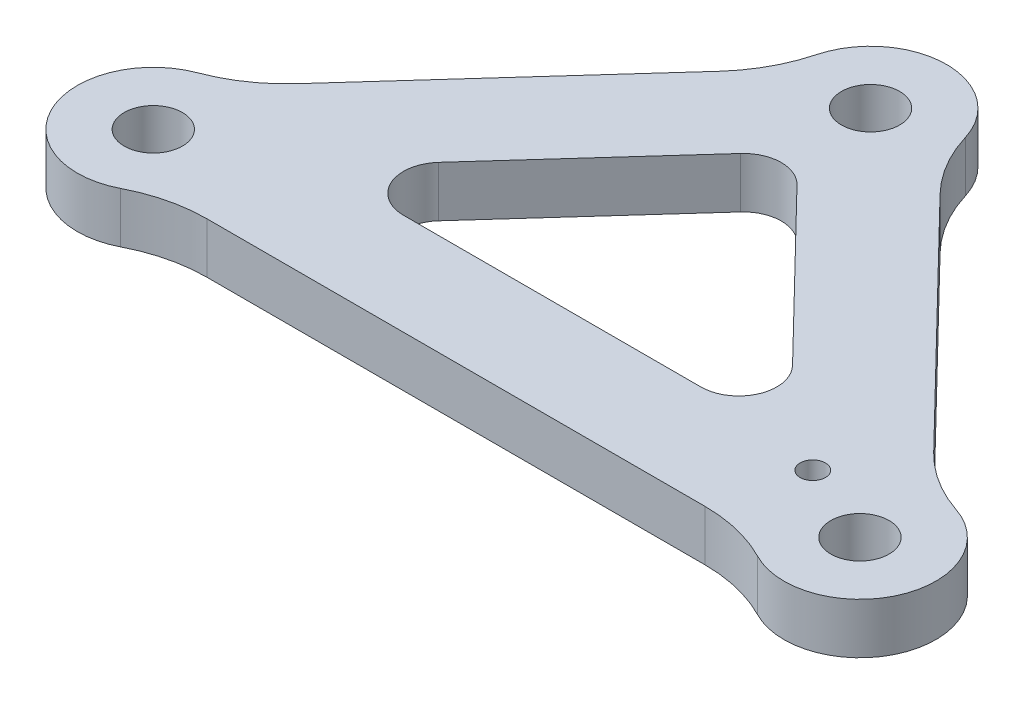
ISO-10303-21;
HEADER;
FILE_DESCRIPTION(('STEP AP214'),'2;1');
FILE_NAME('part.step','',(''),(''),'','','');
FILE_SCHEMA(('AUTOMOTIVE_DESIGN { 1 0 10303 214 1 1 1 1 }'));
ENDSEC;
DATA;
#1=APPLICATION_CONTEXT('core data for automotive mechanical design processes');
#2=APPLICATION_PROTOCOL_DEFINITION('international standard','automotive_design',2000,#1);
#3=PRODUCT_CONTEXT('',#1,'mechanical');
#4=PRODUCT('Part','Part','',(#3));
#5=PRODUCT_RELATED_PRODUCT_CATEGORY('part','',(#4));
#6=PRODUCT_DEFINITION_FORMATION('','',#4);
#7=PRODUCT_DEFINITION_CONTEXT('part definition',#1,'design');
#8=PRODUCT_DEFINITION('design','',#6,#7);
#9=PRODUCT_DEFINITION_SHAPE('','',#8);
#10=(LENGTH_UNIT() NAMED_UNIT(*) SI_UNIT(.MILLI.,.METRE.));
#11=(NAMED_UNIT(*) PLANE_ANGLE_UNIT() SI_UNIT($,.RADIAN.));
#12=(NAMED_UNIT(*) SI_UNIT($,.STERADIAN.) SOLID_ANGLE_UNIT());
#13=UNCERTAINTY_MEASURE_WITH_UNIT(LENGTH_MEASURE(1.E-05),#10,'distance_accuracy_value','');
#14=(GEOMETRIC_REPRESENTATION_CONTEXT(3) GLOBAL_UNCERTAINTY_ASSIGNED_CONTEXT((#13)) GLOBAL_UNIT_ASSIGNED_CONTEXT((#10,
#11,#12)) REPRESENTATION_CONTEXT('',''));
#15=CARTESIAN_POINT('',(0.,0.,0.));
#16=DIRECTION('',(0.,0.,1.));
#17=DIRECTION('',(1.,0.,0.));
#18=AXIS2_PLACEMENT_3D('',#15,#16,#17);
#19=CARTESIAN_POINT('',(-1.48430145110191,2.,-1.34046603920307));
#20=DIRECTION('',(0.742150725550956,0.,0.670233019601534));
#21=DIRECTION('',(0.670233019601534,0.,-0.742150725550956));
#22=AXIS2_PLACEMENT_3D('',#19,#20,#21);
#23=PLANE('',#22);
#24=DIRECTION('',(-0.670233019601534,0.,0.742150725550956));
#25=VECTOR('',#24,1.);
#26=CARTESIAN_POINT('',(-1.48430145110191,2.,-1.34046603920307));
#27=LINE('',#26,#25);
#28=CARTESIAN_POINT('',(9.19042905831505,2.,-13.1606222549244));
#29=VERTEX_POINT('',#28);
#30=CARTESIAN_POINT('',(1.27914008249189,2.,-4.40043187077845));
#31=VERTEX_POINT('',#30);
#32=EDGE_CURVE('E300',#29,#31,#27,.T.);
#33=ORIENTED_EDGE('',*,*,#32,.F.);
#34=DIRECTION('',(0.,1.,0.));
#35=VECTOR('',#34,1.);
#36=CARTESIAN_POINT('',(9.19042905831505,0.,-13.1606222549244));
#37=LINE('',#36,#35);
#38=CARTESIAN_POINT('',(9.19042905831505,0.,-13.1606222549244));
#39=VERTEX_POINT('',#38);
#40=EDGE_CURVE('E209',#29,#39,#37,.F.);
#41=ORIENTED_EDGE('',*,*,#40,.T.);
#42=DIRECTION('',(-0.670233019601534,0.,0.742150725550956));
#43=VECTOR('',#42,1.);
#44=CARTESIAN_POINT('',(-1.48430145110191,0.,-1.34046603920307));
#45=LINE('',#44,#43);
#46=CARTESIAN_POINT('',(1.27914008249189,0.,-4.40043187077845));
#47=VERTEX_POINT('',#46);
#48=EDGE_CURVE('E331',#39,#47,#45,.T.);
#49=ORIENTED_EDGE('',*,*,#48,.T.);
#50=DIRECTION('',(0.,1.,0.));
#51=VECTOR('',#50,1.);
#52=CARTESIAN_POINT('',(1.27914008249189,2.,-4.40043187077845));
#53=LINE('',#52,#51);
#54=EDGE_CURVE('E207',#47,#31,#53,.T.);
#55=ORIENTED_EDGE('',*,*,#54,.T.);
#56=EDGE_LOOP('',(#33,#41,#49,#55));
#57=FACE_BOUND('',#56,.T.);
#58=ADVANCED_FACE('F41',(#57),#23,.F.);
#59=CARTESIAN_POINT('',(0.,2.,0.));
#60=DIRECTION('',(0.,-1.,0.));
#61=DIRECTION('',(0.,0.,-1.));
#62=AXIS2_PLACEMENT_3D('',#59,#60,#61);
#63=CYLINDRICAL_SURFACE('',#62,3.);
#64=CARTESIAN_POINT('',(0.,2.,0.));
#65=DIRECTION('',(0.,1.,0.));
#66=DIRECTION('',(0.,0.,1.));
#67=AXIS2_PLACEMENT_3D('',#64,#65,#66);
#68=CIRCLE('',#67,3.);
#69=CARTESIAN_POINT('',(-1.05792142360461,2.,-2.80727666279588));
#70=VERTEX_POINT('',#69);
#71=CARTESIAN_POINT('',(1.37436854187255,2.,2.66666666666667));
#72=VERTEX_POINT('',#71);
#73=EDGE_CURVE('E303',#70,#72,#68,.T.);
#74=ORIENTED_EDGE('',*,*,#73,.F.);
#75=DIRECTION('',(0.,-1.,0.));
#76=VECTOR('',#75,1.);
#77=CARTESIAN_POINT('',(-1.05792142360461,2.,-2.80727666279588));
#78=LINE('',#77,#76);
#79=CARTESIAN_POINT('',(-1.05792142360461,0.,-2.80727666279588));
#80=VERTEX_POINT('',#79);
#81=EDGE_CURVE('E214',#70,#80,#78,.T.);
#82=ORIENTED_EDGE('',*,*,#81,.T.);
#83=CARTESIAN_POINT('',(0.,0.,0.));
#84=DIRECTION('',(0.,1.,0.));
#85=DIRECTION('',(0.,0.,1.));
#86=AXIS2_PLACEMENT_3D('',#83,#84,#85);
#87=CIRCLE('',#86,3.);
#88=CARTESIAN_POINT('',(1.37436854187255,0.,2.66666666666667));
#89=VERTEX_POINT('',#88);
#90=EDGE_CURVE('E334',#80,#89,#87,.T.);
#91=ORIENTED_EDGE('',*,*,#90,.T.);
#92=DIRECTION('',(0.,-1.,0.));
#93=VECTOR('',#92,1.);
#94=CARTESIAN_POINT('',(1.37436854187255,2.,2.66666666666667));
#95=LINE('',#94,#93);
#96=EDGE_CURVE('E212',#89,#72,#95,.F.);
#97=ORIENTED_EDGE('',*,*,#96,.T.);
#98=EDGE_LOOP('',(#74,#82,#91,#97));
#99=FACE_BOUND('',#98,.T.);
#100=ADVANCED_FACE('F369',(#99),#63,.T.);
#101=CARTESIAN_POINT('',(0.,2.,2.));
#102=DIRECTION('',(0.,0.,1.));
#103=DIRECTION('',(1.,0.,0.));
#104=AXIS2_PLACEMENT_3D('',#101,#102,#103);
#105=PLANE('',#104);
#106=DIRECTION('',(-1.,0.,0.));
#107=VECTOR('',#106,1.);
#108=CARTESIAN_POINT('',(0.,2.,2.));
#109=LINE('',#108,#107);
#110=CARTESIAN_POINT('',(23.7768943743823,2.,2.));
#111=VERTEX_POINT('',#110);
#112=CARTESIAN_POINT('',(4.12310562561766,2.,2.));
#113=VERTEX_POINT('',#112);
#114=EDGE_CURVE('E306',#111,#113,#109,.T.);
#115=ORIENTED_EDGE('',*,*,#114,.T.);
#116=DIRECTION('',(0.,-1.,0.));
#117=VECTOR('',#116,1.);
#118=CARTESIAN_POINT('',(4.12310562561766,2.,2.));
#119=LINE('',#118,#117);
#120=CARTESIAN_POINT('',(4.12310562561766,0.,2.));
#121=VERTEX_POINT('',#120);
#122=EDGE_CURVE('E219',#113,#121,#119,.T.);
#123=ORIENTED_EDGE('',*,*,#122,.T.);
#124=DIRECTION('',(-1.,0.,0.));
#125=VECTOR('',#124,1.);
#126=CARTESIAN_POINT('',(0.,0.,2.));
#127=LINE('',#126,#125);
#128=CARTESIAN_POINT('',(23.7768943743823,0.,2.));
#129=VERTEX_POINT('',#128);
#130=EDGE_CURVE('E337',#129,#121,#127,.T.);
#131=ORIENTED_EDGE('',*,*,#130,.F.);
#132=DIRECTION('',(0.,-1.,0.));
#133=VECTOR('',#132,1.);
#134=CARTESIAN_POINT('',(23.7768943743823,2.,2.));
#135=LINE('',#134,#133);
#136=EDGE_CURVE('E217',#129,#111,#135,.F.);
#137=ORIENTED_EDGE('',*,*,#136,.T.);
#138=EDGE_LOOP('',(#115,#123,#131,#137));
#139=FACE_BOUND('',#138,.T.);
#140=ADVANCED_FACE('F365',(#139),#105,.T.);
#141=CARTESIAN_POINT('',(27.9,2.,0.));
#142=DIRECTION('',(0.,-1.,0.));
#143=DIRECTION('',(0.,0.,-1.));
#144=AXIS2_PLACEMENT_3D('',#141,#142,#143);
#145=CYLINDRICAL_SURFACE('',#144,3.);
#146=CARTESIAN_POINT('',(27.9,2.,0.));
#147=DIRECTION('',(0.,1.,0.));
#148=DIRECTION('',(0.,0.,1.));
#149=AXIS2_PLACEMENT_3D('',#146,#147,#148);
#150=CIRCLE('',#149,3.);
#151=CARTESIAN_POINT('',(26.5256314581274,2.,2.66666666666667));
#152=VERTEX_POINT('',#151);
#153=CARTESIAN_POINT('',(28.8544310389108,2.,-2.8441275273735));
#154=VERTEX_POINT('',#153);
#155=EDGE_CURVE('E309',#152,#154,#150,.T.);
#156=ORIENTED_EDGE('',*,*,#155,.F.);
#157=DIRECTION('',(0.,-1.,0.));
#158=VECTOR('',#157,1.);
#159=CARTESIAN_POINT('',(26.5256314581274,2.,2.66666666666667));
#160=LINE('',#159,#158);
#161=CARTESIAN_POINT('',(26.5256314581274,0.,2.66666666666667));
#162=VERTEX_POINT('',#161);
#163=EDGE_CURVE('E177',#152,#162,#160,.T.);
#164=ORIENTED_EDGE('',*,*,#163,.T.);
#165=CARTESIAN_POINT('',(27.9,0.,0.));
#166=DIRECTION('',(0.,1.,0.));
#167=DIRECTION('',(0.,0.,1.));
#168=AXIS2_PLACEMENT_3D('',#165,#166,#167);
#169=CIRCLE('',#168,3.);
#170=CARTESIAN_POINT('',(28.8544310389108,0.,-2.8441275273735));
#171=VERTEX_POINT('',#170);
#172=EDGE_CURVE('E199',#162,#171,#169,.T.);
#173=ORIENTED_EDGE('',*,*,#172,.T.);
#174=DIRECTION('',(0.,-1.,0.));
#175=VECTOR('',#174,1.);
#176=CARTESIAN_POINT('',(28.8544310389108,2.,-2.8441275273735));
#177=LINE('',#176,#175);
#178=EDGE_CURVE('E222',#171,#154,#177,.F.);
#179=ORIENTED_EDGE('',*,*,#178,.T.);
#180=EDGE_LOOP('',(#156,#164,#173,#179));
#181=FACE_BOUND('',#180,.T.);
#182=ADVANCED_FACE('F344',(#181),#145,.T.);
#183=CARTESIAN_POINT('',(15.7818857000714,2.,-15.338242193569));
#184=DIRECTION('',(0.71711431553237,0.,-0.696955564192253));
#185=DIRECTION('',(-0.696955564192253,0.,-0.71711431553237));
#186=AXIS2_PLACEMENT_3D('',#183,#184,#185);
#187=PLANE('',#186);
#188=DIRECTION('',(0.696955564192253,0.,0.71711431553237));
#189=VECTOR('',#188,1.);
#190=CARTESIAN_POINT('',(15.7818857000714,0.,-15.338242193569));
#191=LINE('',#190,#189);
#192=CARTESIAN_POINT('',(17.7460220816021,0.,-13.3172951070987));
#193=VERTEX_POINT('',#192);
#194=CARTESIAN_POINT('',(26.4606072235381,0.,-4.35064919696697));
#195=VERTEX_POINT('',#194);
#196=EDGE_CURVE('E194',#193,#195,#191,.T.);
#197=ORIENTED_EDGE('',*,*,#196,.F.);
#198=DIRECTION('',(0.,-1.,0.));
#199=VECTOR('',#198,1.);
#200=CARTESIAN_POINT('',(17.7460220816021,2.,-13.3172951070987));
#201=LINE('',#200,#199);
#202=CARTESIAN_POINT('',(17.7460220816021,2.,-13.3172951070987));
#203=VERTEX_POINT('',#202);
#204=EDGE_CURVE('E171',#193,#203,#201,.F.);
#205=ORIENTED_EDGE('',*,*,#204,.T.);
#206=DIRECTION('',(0.696955564192253,0.,0.71711431553237));
#207=VECTOR('',#206,1.);
#208=CARTESIAN_POINT('',(15.7818857000714,2.,-15.338242193569));
#209=LINE('',#208,#207);
#210=CARTESIAN_POINT('',(26.4606072235381,2.,-4.35064919696697));
#211=VERTEX_POINT('',#210);
#212=EDGE_CURVE('E312',#203,#211,#209,.T.);
#213=ORIENTED_EDGE('',*,*,#212,.T.);
#214=DIRECTION('',(0.,-1.,0.));
#215=VECTOR('',#214,1.);
#216=CARTESIAN_POINT('',(26.4606072235381,2.,-4.35064919696697));
#217=LINE('',#216,#215);
#218=EDGE_CURVE('E187',#211,#195,#217,.T.);
#219=ORIENTED_EDGE('',*,*,#218,.T.);
#220=EDGE_LOOP('',(#197,#205,#213,#219));
#221=FACE_BOUND('',#220,.T.);
#222=ADVANCED_FACE('F354',(#221),#187,.T.);
#223=CARTESIAN_POINT('',(1.48430145110192,2.,1.34046603920307));
#224=DIRECTION('',(0.742150725550956,0.,0.670233019601534));
#225=DIRECTION('',(0.670233019601534,0.,-0.742150725550956));
#226=AXIS2_PLACEMENT_3D('',#223,#224,#225);
#227=PLANE('',#226);
#228=DIRECTION('',(-0.670233019601534,0.,0.742150725550956));
#229=VECTOR('',#228,1.);
#230=CARTESIAN_POINT('',(1.48430145110192,0.,1.34046603920307));
#231=LINE('',#230,#229);
#232=CARTESIAN_POINT('',(12.4186735848156,0.,-10.7671920068065));
#233=VERTEX_POINT('',#232);
#234=CARTESIAN_POINT('',(6.76363149241038,0.,-4.5053495294023));
#235=VERTEX_POINT('',#234);
#236=EDGE_CURVE('E281',#233,#235,#231,.T.);
#237=ORIENTED_EDGE('',*,*,#236,.F.);
#238=DIRECTION('',(0.,-1.,0.));
#239=VECTOR('',#238,1.);
#240=CARTESIAN_POINT('',(12.4186735848156,2.,-10.7671920068065));
#241=LINE('',#240,#239);
#242=CARTESIAN_POINT('',(12.4186735848156,2.,-10.7671920068065));
#243=VERTEX_POINT('',#242);
#244=EDGE_CURVE('E254',#233,#243,#241,.F.);
#245=ORIENTED_EDGE('',*,*,#244,.T.);
#246=DIRECTION('',(-0.670233019601534,0.,0.742150725550956));
#247=VECTOR('',#246,1.);
#248=CARTESIAN_POINT('',(1.48430145110192,2.,1.34046603920307));
#249=LINE('',#248,#247);
#250=CARTESIAN_POINT('',(6.76363149241038,2.,-4.5053495294023));
#251=VERTEX_POINT('',#250);
#252=EDGE_CURVE('E197',#243,#251,#249,.T.);
#253=ORIENTED_EDGE('',*,*,#252,.T.);
#254=DIRECTION('',(0.,-1.,0.));
#255=VECTOR('',#254,1.);
#256=CARTESIAN_POINT('',(6.76363149241038,2.,-4.5053495294023));
#257=LINE('',#256,#255);
#258=EDGE_CURVE('E251',#251,#235,#257,.T.);
#259=ORIENTED_EDGE('',*,*,#258,.T.);
#260=EDGE_LOOP('',(#237,#245,#253,#259));
#261=FACE_BOUND('',#260,.T.);
#262=ADVANCED_FACE('F356',(#261),#227,.T.);
#263=CARTESIAN_POINT('',(12.913428437942,2.,-12.5504199368));
#264=DIRECTION('',(0.717114315532369,0.,-0.696955564192253));
#265=DIRECTION('',(-0.696955564192253,0.,-0.717114315532369));
#266=AXIS2_PLACEMENT_3D('',#263,#264,#265);
#267=PLANE('',#266);
#268=DIRECTION('',(0.696955564192253,0.,0.717114315532369));
#269=VECTOR('',#268,1.);
#270=CARTESIAN_POINT('',(12.913428437942,2.,-12.5504199368));
#271=LINE('',#270,#269);
#272=CARTESIAN_POINT('',(14.6075711464406,2.,-10.8072758236926));
#273=VERTEX_POINT('',#272);
#274=CARTESIAN_POINT('',(20.6933873994356,2.,-4.54543334628838));
#275=VERTEX_POINT('',#274);
#276=EDGE_CURVE('E287',#273,#275,#271,.T.);
#277=ORIENTED_EDGE('',*,*,#276,.F.);
#278=DIRECTION('',(0.,-1.,0.));
#279=VECTOR('',#278,1.);
#280=CARTESIAN_POINT('',(14.6075711464406,2.,-10.8072758236926));
#281=LINE('',#280,#279);
#282=CARTESIAN_POINT('',(14.6075711464406,0.,-10.8072758236926));
#283=VERTEX_POINT('',#282);
#284=EDGE_CURVE('E248',#273,#283,#281,.T.);
#285=ORIENTED_EDGE('',*,*,#284,.T.);
#286=DIRECTION('',(0.696955564192253,0.,0.717114315532369));
#287=VECTOR('',#286,1.);
#288=CARTESIAN_POINT('',(12.913428437942,0.,-12.5504199368));
#289=LINE('',#288,#287);
#290=CARTESIAN_POINT('',(20.6933873994356,0.,-4.54543334628838));
#291=VERTEX_POINT('',#290);
#292=EDGE_CURVE('E272',#283,#291,#289,.T.);
#293=ORIENTED_EDGE('',*,*,#292,.T.);
#294=DIRECTION('',(0.,-1.,0.));
#295=VECTOR('',#294,1.);
#296=CARTESIAN_POINT('',(20.6933873994356,2.,-4.54543334628838));
#297=LINE('',#296,#295);
#298=EDGE_CURVE('E246',#291,#275,#297,.F.);
#299=ORIENTED_EDGE('',*,*,#298,.T.);
#300=EDGE_LOOP('',(#277,#285,#293,#299));
#301=FACE_BOUND('',#300,.T.);
#302=ADVANCED_FACE('F279',(#301),#267,.F.);
#303=CARTESIAN_POINT('',(13.4381720430108,2.,-14.8801220472967));
#304=DIRECTION('',(0.,-1.,0.));
#305=DIRECTION('',(0.,0.,-1.));
#306=AXIS2_PLACEMENT_3D('',#303,#304,#305);
#307=CYLINDRICAL_SURFACE('',#306,1.15);
#308=CARTESIAN_POINT('',(13.4381720430108,2.,-14.8801220472967));
#309=DIRECTION('',(0.,1.,0.));
#310=DIRECTION('',(0.,0.,1.));
#311=AXIS2_PLACEMENT_3D('',#308,#309,#310);
#312=CIRCLE('',#311,1.15);
#313=CARTESIAN_POINT('',(13.4381720430108,2.,-13.7301220472967));
#314=VERTEX_POINT('',#313);
#315=EDGE_CURVE('E297',#314,#314,#312,.T.);
#316=ORIENTED_EDGE('',*,*,#315,.T.);
#317=EDGE_LOOP('',(#316));
#318=FACE_BOUND('',#317,.T.);
#319=CARTESIAN_POINT('',(13.4381720430108,0.,-14.8801220472967));
#320=DIRECTION('',(0.,1.,0.));
#321=DIRECTION('',(0.,0.,1.));
#322=AXIS2_PLACEMENT_3D('',#319,#320,#321);
#323=CIRCLE('',#322,1.15);
#324=CARTESIAN_POINT('',(13.4381720430108,0.,-13.7301220472967));
#325=VERTEX_POINT('',#324);
#326=EDGE_CURVE('E328',#325,#325,#323,.T.);
#327=ORIENTED_EDGE('',*,*,#326,.F.);
#328=EDGE_LOOP('',(#327));
#329=FACE_BOUND('',#328,.T.);
#330=ADVANCED_FACE('F381',(#318,#329),#307,.F.);
#331=CARTESIAN_POINT('',(27.9,2.,0.));
#332=DIRECTION('',(0.,-1.,0.));
#333=DIRECTION('',(0.,0.,-1.));
#334=AXIS2_PLACEMENT_3D('',#331,#332,#333);
#335=CYLINDRICAL_SURFACE('',#334,1.15);
#336=CARTESIAN_POINT('',(27.9,2.,0.));
#337=DIRECTION('',(0.,1.,0.));
#338=DIRECTION('',(0.,0.,1.));
#339=AXIS2_PLACEMENT_3D('',#336,#337,#338);
#340=CIRCLE('',#339,1.15);
#341=CARTESIAN_POINT('',(27.9,2.,1.15));
#342=VERTEX_POINT('',#341);
#343=EDGE_CURVE('E290',#342,#342,#340,.T.);
#344=ORIENTED_EDGE('',*,*,#343,.T.);
#345=EDGE_LOOP('',(#344));
#346=FACE_BOUND('',#345,.T.);
#347=CARTESIAN_POINT('',(27.9,0.,0.));
#348=DIRECTION('',(0.,1.,0.));
#349=DIRECTION('',(0.,0.,1.));
#350=AXIS2_PLACEMENT_3D('',#347,#348,#349);
#351=CIRCLE('',#350,1.15);
#352=CARTESIAN_POINT('',(27.9,0.,1.15));
#353=VERTEX_POINT('',#352);
#354=EDGE_CURVE('E325',#353,#353,#351,.T.);
#355=ORIENTED_EDGE('',*,*,#354,.F.);
#356=EDGE_LOOP('',(#355));
#357=FACE_BOUND('',#356,.T.);
#358=ADVANCED_FACE('F384',(#346,#357),#335,.F.);
#359=CARTESIAN_POINT('',(0.,2.,0.));
#360=DIRECTION('',(0.,-1.,0.));
#361=DIRECTION('',(0.,0.,-1.));
#362=AXIS2_PLACEMENT_3D('',#359,#360,#361);
#363=CYLINDRICAL_SURFACE('',#362,1.15);
#364=CARTESIAN_POINT('',(0.,2.,0.));
#365=DIRECTION('',(0.,1.,0.));
#366=DIRECTION('',(0.,0.,1.));
#367=AXIS2_PLACEMENT_3D('',#364,#365,#366);
#368=CIRCLE('',#367,1.15);
#369=CARTESIAN_POINT('',(0.,2.,1.15));
#370=VERTEX_POINT('',#369);
#371=EDGE_CURVE('E286',#370,#370,#368,.T.);
#372=ORIENTED_EDGE('',*,*,#371,.T.);
#373=EDGE_LOOP('',(#372));
#374=FACE_BOUND('',#373,.T.);
#375=CARTESIAN_POINT('',(0.,0.,0.));
#376=DIRECTION('',(0.,1.,0.));
#377=DIRECTION('',(0.,0.,1.));
#378=AXIS2_PLACEMENT_3D('',#375,#376,#377);
#379=CIRCLE('',#378,1.15);
#380=CARTESIAN_POINT('',(0.,0.,1.15));
#381=VERTEX_POINT('',#380);
#382=EDGE_CURVE('E322',#381,#381,#379,.T.);
#383=ORIENTED_EDGE('',*,*,#382,.F.);
#384=EDGE_LOOP('',(#383));
#385=FACE_BOUND('',#384,.T.);
#386=ADVANCED_FACE('F388',(#374,#385),#363,.F.);
#387=CARTESIAN_POINT('',(0.,2.,-2.));
#388=DIRECTION('',(0.,0.,1.));
#389=DIRECTION('',(1.,0.,0.));
#390=AXIS2_PLACEMENT_3D('',#387,#388,#389);
#391=PLANE('',#390);
#392=DIRECTION('',(-1.,0.,0.));
#393=VECTOR('',#392,1.);
#394=CARTESIAN_POINT('',(0.,0.,-2.));
#395=LINE('',#394,#393);
#396=CARTESIAN_POINT('',(19.617715926137,0.,-2.));
#397=VERTEX_POINT('',#396);
#398=CARTESIAN_POINT('',(7.87685758073681,0.,-2.));
#399=VERTEX_POINT('',#398);
#400=EDGE_CURVE('E273',#397,#399,#395,.T.);
#401=ORIENTED_EDGE('',*,*,#400,.T.);
#402=DIRECTION('',(0.,-1.,0.));
#403=VECTOR('',#402,1.);
#404=CARTESIAN_POINT('',(7.87685758073681,2.,-2.));
#405=LINE('',#404,#403);
#406=CARTESIAN_POINT('',(7.87685758073681,2.,-2.));
#407=VERTEX_POINT('',#406);
#408=EDGE_CURVE('E56',#399,#407,#405,.F.);
#409=ORIENTED_EDGE('',*,*,#408,.T.);
#410=DIRECTION('',(-1.,0.,0.));
#411=VECTOR('',#410,1.);
#412=CARTESIAN_POINT('',(0.,2.,-2.));
#413=LINE('',#412,#411);
#414=CARTESIAN_POINT('',(19.617715926137,2.,-2.));
#415=VERTEX_POINT('',#414);
#416=EDGE_CURVE('E284',#415,#407,#413,.T.);
#417=ORIENTED_EDGE('',*,*,#416,.F.);
#418=DIRECTION('',(0.,-1.,0.));
#419=VECTOR('',#418,1.);
#420=CARTESIAN_POINT('',(19.617715926137,0.,-2.));
#421=LINE('',#420,#419);
#422=EDGE_CURVE('E256',#415,#397,#421,.T.);
#423=ORIENTED_EDGE('',*,*,#422,.T.);
#424=EDGE_LOOP('',(#401,#409,#417,#423));
#425=FACE_BOUND('',#424,.T.);
#426=ADVANCED_FACE('F283',(#425),#391,.F.);
#427=CARTESIAN_POINT('',(24.6760501197014,2.,-1.36240492120458));
#428=DIRECTION('',(0.,-1.,0.));
#429=DIRECTION('',(0.,0.,-1.));
#430=AXIS2_PLACEMENT_3D('',#427,#428,#429);
#431=CYLINDRICAL_SURFACE('',#430,0.499999999999999);
#432=CARTESIAN_POINT('',(24.6760501197014,2.,-1.36240492120458));
#433=DIRECTION('',(0.,1.,0.));
#434=DIRECTION('',(0.,0.,1.));
#435=AXIS2_PLACEMENT_3D('',#432,#433,#434);
#436=CIRCLE('',#435,0.499999999999999);
#437=CARTESIAN_POINT('',(24.6760501197014,2.,-0.862404921204578));
#438=VERTEX_POINT('',#437);
#439=EDGE_CURVE('E193',#438,#438,#436,.T.);
#440=ORIENTED_EDGE('',*,*,#439,.T.);
#441=EDGE_LOOP('',(#440));
#442=FACE_BOUND('',#441,.T.);
#443=CARTESIAN_POINT('',(24.6760501197014,0.,-1.36240492120458));
#444=DIRECTION('',(0.,1.,0.));
#445=DIRECTION('',(0.,0.,1.));
#446=AXIS2_PLACEMENT_3D('',#443,#444,#445);
#447=CIRCLE('',#446,0.499999999999999);
#448=CARTESIAN_POINT('',(24.6760501197014,0.,-0.862404921204578));
#449=VERTEX_POINT('',#448);
#450=EDGE_CURVE('E316',#449,#449,#447,.T.);
#451=ORIENTED_EDGE('',*,*,#450,.F.);
#452=EDGE_LOOP('',(#451));
#453=FACE_BOUND('',#452,.T.);
#454=ADVANCED_FACE('F395',(#442,#453),#431,.F.);
#455=CARTESIAN_POINT('',(13.4381720430108,2.,-14.8801220472967));
#456=DIRECTION('',(0.,-1.,0.));
#457=DIRECTION('',(0.,0.,-1.));
#458=AXIS2_PLACEMENT_3D('',#455,#456,#457);
#459=CYLINDRICAL_SURFACE('',#458,3.);
#460=CARTESIAN_POINT('',(13.4381720430108,2.,-14.8801220472967));
#461=DIRECTION('',(0.,1.,0.));
#462=DIRECTION('',(0.,0.,1.));
#463=AXIS2_PLACEMENT_3D('',#460,#461,#462);
#464=CIRCLE('',#463,3.);
#465=CARTESIAN_POINT('',(16.3083506869393,2.,-15.7530908622819));
#466=VERTEX_POINT('',#465);
#467=CARTESIAN_POINT('',(10.5379562636769,2.,-15.6474214890423));
#468=VERTEX_POINT('',#467);
#469=EDGE_CURVE('E186',#466,#468,#464,.T.);
#470=ORIENTED_EDGE('',*,*,#469,.F.);
#471=DIRECTION('',(0.,-1.,0.));
#472=VECTOR('',#471,1.);
#473=CARTESIAN_POINT('',(16.3083506869393,2.,-15.7530908622819));
#474=LINE('',#473,#472);
#475=CARTESIAN_POINT('',(16.3083506869393,0.,-15.7530908622819));
#476=VERTEX_POINT('',#475);
#477=EDGE_CURVE('E170',#466,#476,#474,.T.);
#478=ORIENTED_EDGE('',*,*,#477,.T.);
#479=CARTESIAN_POINT('',(13.4381720430108,0.,-14.8801220472967));
#480=DIRECTION('',(0.,1.,0.));
#481=DIRECTION('',(0.,0.,1.));
#482=AXIS2_PLACEMENT_3D('',#479,#480,#481);
#483=CIRCLE('',#482,3.);
#484=CARTESIAN_POINT('',(10.5379562636769,0.,-15.6474214890423));
#485=VERTEX_POINT('',#484);
#486=EDGE_CURVE('E183',#476,#485,#483,.T.);
#487=ORIENTED_EDGE('',*,*,#486,.T.);
#488=DIRECTION('',(0.,-1.,0.));
#489=VECTOR('',#488,1.);
#490=CARTESIAN_POINT('',(10.5379562636769,2.,-15.6474214890423));
#491=LINE('',#490,#489);
#492=EDGE_CURVE('E188',#485,#468,#491,.F.);
#493=ORIENTED_EDGE('',*,*,#492,.T.);
#494=EDGE_LOOP('',(#470,#478,#487,#493));
#495=FACE_BOUND('',#494,.T.);
#496=ADVANCED_FACE('F182',(#495),#459,.T.);
#497=CARTESIAN_POINT('',(0.,2.,0.));
#498=DIRECTION('',(0.,1.,0.));
#499=DIRECTION('',(0.,0.,1.));
#500=AXIS2_PLACEMENT_3D('',#497,#498,#499);
#501=PLANE('',#500);
#502=ORIENTED_EDGE('',*,*,#439,.F.);
#503=EDGE_LOOP('',(#502));
#504=FACE_BOUND('',#503,.T.);
#505=ORIENTED_EDGE('',*,*,#252,.F.);
#506=CARTESIAN_POINT('',(13.5318996731421,2.,-9.76184247740419));
#507=DIRECTION('',(0.,1.,0.));
#508=DIRECTION('',(0.,0.,1.));
#509=AXIS2_PLACEMENT_3D('',#506,#507,#508);
#510=CIRCLE('',#509,1.5);
#511=EDGE_CURVE('E262',#243,#273,#510,.F.);
#512=ORIENTED_EDGE('',*,*,#511,.T.);
#513=ORIENTED_EDGE('',*,*,#276,.T.);
#514=CARTESIAN_POINT('',(19.617715926137,2.,-3.5));
#515=DIRECTION('',(0.,1.,0.));
#516=DIRECTION('',(0.,0.,1.));
#517=AXIS2_PLACEMENT_3D('',#514,#515,#516);
#518=CIRCLE('',#517,1.5);
#519=EDGE_CURVE('E11',#275,#415,#518,.F.);
#520=ORIENTED_EDGE('',*,*,#519,.T.);
#521=ORIENTED_EDGE('',*,*,#416,.T.);
#522=CARTESIAN_POINT('',(7.87685758073681,2.,-3.5));
#523=DIRECTION('',(0.,1.,0.));
#524=DIRECTION('',(0.,0.,1.));
#525=AXIS2_PLACEMENT_3D('',#522,#523,#524);
#526=CIRCLE('',#525,1.5);
#527=EDGE_CURVE('E266',#407,#251,#526,.F.);
#528=ORIENTED_EDGE('',*,*,#527,.T.);
#529=EDGE_LOOP('',(#505,#512,#513,#520,#521,#528));
#530=FACE_BOUND('',#529,.T.);
#531=ORIENTED_EDGE('',*,*,#371,.F.);
#532=EDGE_LOOP('',(#531));
#533=FACE_BOUND('',#532,.T.);
#534=ORIENTED_EDGE('',*,*,#343,.F.);
#535=EDGE_LOOP('',(#534));
#536=FACE_BOUND('',#535,.T.);
#537=ORIENTED_EDGE('',*,*,#315,.F.);
#538=EDGE_LOOP('',(#537));
#539=FACE_BOUND('',#538,.T.);
#540=ORIENTED_EDGE('',*,*,#469,.T.);
#541=CARTESIAN_POINT('',(4.73752470500931,2.,-17.1820203725336));
#542=DIRECTION('',(0.,1.,0.));
#543=DIRECTION('',(0.,0.,1.));
#544=AXIS2_PLACEMENT_3D('',#541,#542,#543);
#545=CIRCLE('',#544,6.);
#546=EDGE_CURVE('E228',#468,#29,#545,.F.);
#547=ORIENTED_EDGE('',*,*,#546,.T.);
#548=ORIENTED_EDGE('',*,*,#32,.T.);
#549=CARTESIAN_POINT('',(-3.17376427081384,2.,-8.42182998838765));
#550=DIRECTION('',(0.,1.,0.));
#551=DIRECTION('',(0.,0.,1.));
#552=AXIS2_PLACEMENT_3D('',#549,#550,#551);
#553=CIRCLE('',#552,6.);
#554=EDGE_CURVE('E232',#31,#70,#553,.F.);
#555=ORIENTED_EDGE('',*,*,#554,.T.);
#556=ORIENTED_EDGE('',*,*,#73,.T.);
#557=CARTESIAN_POINT('',(4.12310562561766,2.,8.));
#558=DIRECTION('',(0.,1.,0.));
#559=DIRECTION('',(0.,0.,1.));
#560=AXIS2_PLACEMENT_3D('',#557,#558,#559);
#561=CIRCLE('',#560,6.);
#562=EDGE_CURVE('E236',#72,#113,#561,.F.);
#563=ORIENTED_EDGE('',*,*,#562,.T.);
#564=ORIENTED_EDGE('',*,*,#114,.F.);
#565=CARTESIAN_POINT('',(23.7768943743823,2.,8.));
#566=DIRECTION('',(0.,1.,0.));
#567=DIRECTION('',(0.,0.,1.));
#568=AXIS2_PLACEMENT_3D('',#565,#566,#567);
#569=CIRCLE('',#568,6.);
#570=EDGE_CURVE('E240',#111,#152,#569,.F.);
#571=ORIENTED_EDGE('',*,*,#570,.T.);
#572=ORIENTED_EDGE('',*,*,#155,.T.);
#573=CARTESIAN_POINT('',(30.7632931167324,2.,-8.53238258212049));
#574=DIRECTION('',(0.,1.,0.));
#575=DIRECTION('',(0.,0.,1.));
#576=AXIS2_PLACEMENT_3D('',#573,#574,#575);
#577=CIRCLE('',#576,6.);
#578=EDGE_CURVE('E244',#154,#211,#577,.F.);
#579=ORIENTED_EDGE('',*,*,#578,.T.);
#580=ORIENTED_EDGE('',*,*,#212,.F.);
#581=CARTESIAN_POINT('',(22.0487079747963,2.,-17.4990284922522));
#582=DIRECTION('',(0.,1.,0.));
#583=DIRECTION('',(0.,0.,1.));
#584=AXIS2_PLACEMENT_3D('',#581,#582,#583);
#585=CIRCLE('',#584,6.);
#586=EDGE_CURVE('E176',#203,#466,#585,.F.);
#587=ORIENTED_EDGE('',*,*,#586,.T.);
#588=EDGE_LOOP('',(#540,#547,#548,#555,#556,#563,#564,#571,#572,#579,#580,#587));
#589=FACE_BOUND('',#588,.T.);
#590=ADVANCED_FACE('F352',(#504,#530,#533,#536,#539,#589),#501,.T.);
#591=CARTESIAN_POINT('',(0.,0.,0.));
#592=DIRECTION('',(0.,1.,0.));
#593=DIRECTION('',(0.,0.,1.));
#594=AXIS2_PLACEMENT_3D('',#591,#592,#593);
#595=PLANE('',#594);
#596=ORIENTED_EDGE('',*,*,#450,.T.);
#597=EDGE_LOOP('',(#596));
#598=FACE_BOUND('',#597,.T.);
#599=ORIENTED_EDGE('',*,*,#292,.F.);
#600=CARTESIAN_POINT('',(13.5318996731421,0.,-9.76184247740419));
#601=DIRECTION('',(0.,1.,0.));
#602=DIRECTION('',(0.,0.,1.));
#603=AXIS2_PLACEMENT_3D('',#600,#601,#602);
#604=CIRCLE('',#603,1.5);
#605=EDGE_CURVE('E260',#283,#233,#604,.T.);
#606=ORIENTED_EDGE('',*,*,#605,.T.);
#607=ORIENTED_EDGE('',*,*,#236,.T.);
#608=CARTESIAN_POINT('',(7.87685758073681,0.,-3.5));
#609=DIRECTION('',(0.,1.,0.));
#610=DIRECTION('',(0.,0.,1.));
#611=AXIS2_PLACEMENT_3D('',#608,#609,#610);
#612=CIRCLE('',#611,1.5);
#613=EDGE_CURVE('E264',#235,#399,#612,.T.);
#614=ORIENTED_EDGE('',*,*,#613,.T.);
#615=ORIENTED_EDGE('',*,*,#400,.F.);
#616=CARTESIAN_POINT('',(19.617715926137,0.,-3.5));
#617=DIRECTION('',(0.,1.,0.));
#618=DIRECTION('',(0.,0.,1.));
#619=AXIS2_PLACEMENT_3D('',#616,#617,#618);
#620=CIRCLE('',#619,1.5);
#621=EDGE_CURVE('E49',#397,#291,#620,.T.);
#622=ORIENTED_EDGE('',*,*,#621,.T.);
#623=EDGE_LOOP('',(#599,#606,#607,#614,#615,#622));
#624=FACE_BOUND('',#623,.T.);
#625=ORIENTED_EDGE('',*,*,#382,.T.);
#626=EDGE_LOOP('',(#625));
#627=FACE_BOUND('',#626,.T.);
#628=ORIENTED_EDGE('',*,*,#354,.T.);
#629=EDGE_LOOP('',(#628));
#630=FACE_BOUND('',#629,.T.);
#631=ORIENTED_EDGE('',*,*,#326,.T.);
#632=EDGE_LOOP('',(#631));
#633=FACE_BOUND('',#632,.T.);
#634=ORIENTED_EDGE('',*,*,#48,.F.);
#635=CARTESIAN_POINT('',(4.73752470500931,0.,-17.1820203725336));
#636=DIRECTION('',(0.,1.,0.));
#637=DIRECTION('',(0.,0.,1.));
#638=AXIS2_PLACEMENT_3D('',#635,#636,#637);
#639=CIRCLE('',#638,6.);
#640=EDGE_CURVE('E192',#39,#485,#639,.T.);
#641=ORIENTED_EDGE('',*,*,#640,.T.);
#642=ORIENTED_EDGE('',*,*,#486,.F.);
#643=CARTESIAN_POINT('',(22.0487079747963,0.,-17.4990284922522));
#644=DIRECTION('',(0.,1.,0.));
#645=DIRECTION('',(0.,0.,1.));
#646=AXIS2_PLACEMENT_3D('',#643,#644,#645);
#647=CIRCLE('',#646,6.);
#648=EDGE_CURVE('E166',#476,#193,#647,.T.);
#649=ORIENTED_EDGE('',*,*,#648,.T.);
#650=ORIENTED_EDGE('',*,*,#196,.T.);
#651=CARTESIAN_POINT('',(30.7632931167324,0.,-8.53238258212049));
#652=DIRECTION('',(0.,1.,0.));
#653=DIRECTION('',(0.,0.,1.));
#654=AXIS2_PLACEMENT_3D('',#651,#652,#653);
#655=CIRCLE('',#654,6.);
#656=EDGE_CURVE('E242',#195,#171,#655,.T.);
#657=ORIENTED_EDGE('',*,*,#656,.T.);
#658=ORIENTED_EDGE('',*,*,#172,.F.);
#659=CARTESIAN_POINT('',(23.7768943743823,0.,8.));
#660=DIRECTION('',(0.,1.,0.));
#661=DIRECTION('',(0.,0.,1.));
#662=AXIS2_PLACEMENT_3D('',#659,#660,#661);
#663=CIRCLE('',#662,6.);
#664=EDGE_CURVE('E238',#162,#129,#663,.T.);
#665=ORIENTED_EDGE('',*,*,#664,.T.);
#666=ORIENTED_EDGE('',*,*,#130,.T.);
#667=CARTESIAN_POINT('',(4.12310562561766,0.,8.));
#668=DIRECTION('',(0.,1.,0.));
#669=DIRECTION('',(0.,0.,1.));
#670=AXIS2_PLACEMENT_3D('',#667,#668,#669);
#671=CIRCLE('',#670,6.);
#672=EDGE_CURVE('E234',#121,#89,#671,.T.);
#673=ORIENTED_EDGE('',*,*,#672,.T.);
#674=ORIENTED_EDGE('',*,*,#90,.F.);
#675=CARTESIAN_POINT('',(-3.17376427081384,0.,-8.42182998838765));
#676=DIRECTION('',(0.,1.,0.));
#677=DIRECTION('',(0.,0.,1.));
#678=AXIS2_PLACEMENT_3D('',#675,#676,#677);
#679=CIRCLE('',#678,6.);
#680=EDGE_CURVE('E230',#80,#47,#679,.T.);
#681=ORIENTED_EDGE('',*,*,#680,.T.);
#682=EDGE_LOOP('',(#634,#641,#642,#649,#650,#657,#658,#665,#666,#673,#674,#681));
#683=FACE_BOUND('',#682,.T.);
#684=ADVANCED_FACE('F191',(#598,#624,#627,#630,#633,#683),#595,.F.);
#685=CARTESIAN_POINT('',(22.0487079747963,2.,-17.4990284922522));
#686=DIRECTION('',(0.,-1.,0.));
#687=DIRECTION('',(0.,0.,-1.));
#688=AXIS2_PLACEMENT_3D('',#685,#686,#687);
#689=CYLINDRICAL_SURFACE('',#688,6.);
#690=ORIENTED_EDGE('',*,*,#586,.F.);
#691=ORIENTED_EDGE('',*,*,#204,.F.);
#692=ORIENTED_EDGE('',*,*,#648,.F.);
#693=ORIENTED_EDGE('',*,*,#477,.F.);
#694=EDGE_LOOP('',(#690,#691,#692,#693));
#695=FACE_BOUND('',#694,.T.);
#696=ADVANCED_FACE('F169',(#695),#689,.F.);
#697=CARTESIAN_POINT('',(4.73752470500931,2.,-17.1820203725336));
#698=DIRECTION('',(0.,-1.,0.));
#699=DIRECTION('',(0.,0.,-1.));
#700=AXIS2_PLACEMENT_3D('',#697,#698,#699);
#701=CYLINDRICAL_SURFACE('',#700,6.);
#702=ORIENTED_EDGE('',*,*,#546,.F.);
#703=ORIENTED_EDGE('',*,*,#492,.F.);
#704=ORIENTED_EDGE('',*,*,#640,.F.);
#705=ORIENTED_EDGE('',*,*,#40,.F.);
#706=EDGE_LOOP('',(#702,#703,#704,#705));
#707=FACE_BOUND('',#706,.T.);
#708=ADVANCED_FACE('F402',(#707),#701,.F.);
#709=CARTESIAN_POINT('',(-3.17376427081384,2.,-8.42182998838765));
#710=DIRECTION('',(0.,-1.,0.));
#711=DIRECTION('',(0.,0.,-1.));
#712=AXIS2_PLACEMENT_3D('',#709,#710,#711);
#713=CYLINDRICAL_SURFACE('',#712,6.);
#714=ORIENTED_EDGE('',*,*,#554,.F.);
#715=ORIENTED_EDGE('',*,*,#54,.F.);
#716=ORIENTED_EDGE('',*,*,#680,.F.);
#717=ORIENTED_EDGE('',*,*,#81,.F.);
#718=EDGE_LOOP('',(#714,#715,#716,#717));
#719=FACE_BOUND('',#718,.T.);
#720=ADVANCED_FACE('F405',(#719),#713,.F.);
#721=CARTESIAN_POINT('',(4.12310562561766,2.,8.));
#722=DIRECTION('',(0.,-1.,0.));
#723=DIRECTION('',(0.,0.,-1.));
#724=AXIS2_PLACEMENT_3D('',#721,#722,#723);
#725=CYLINDRICAL_SURFACE('',#724,6.);
#726=ORIENTED_EDGE('',*,*,#562,.F.);
#727=ORIENTED_EDGE('',*,*,#96,.F.);
#728=ORIENTED_EDGE('',*,*,#672,.F.);
#729=ORIENTED_EDGE('',*,*,#122,.F.);
#730=EDGE_LOOP('',(#726,#727,#728,#729));
#731=FACE_BOUND('',#730,.T.);
#732=ADVANCED_FACE('F409',(#731),#725,.F.);
#733=CARTESIAN_POINT('',(23.7768943743823,2.,8.));
#734=DIRECTION('',(0.,-1.,0.));
#735=DIRECTION('',(0.,0.,-1.));
#736=AXIS2_PLACEMENT_3D('',#733,#734,#735);
#737=CYLINDRICAL_SURFACE('',#736,6.);
#738=ORIENTED_EDGE('',*,*,#570,.F.);
#739=ORIENTED_EDGE('',*,*,#136,.F.);
#740=ORIENTED_EDGE('',*,*,#664,.F.);
#741=ORIENTED_EDGE('',*,*,#163,.F.);
#742=EDGE_LOOP('',(#738,#739,#740,#741));
#743=FACE_BOUND('',#742,.T.);
#744=ADVANCED_FACE('F413',(#743),#737,.F.);
#745=CARTESIAN_POINT('',(30.7632931167324,2.,-8.53238258212049));
#746=DIRECTION('',(0.,-1.,0.));
#747=DIRECTION('',(0.,0.,-1.));
#748=AXIS2_PLACEMENT_3D('',#745,#746,#747);
#749=CYLINDRICAL_SURFACE('',#748,6.);
#750=ORIENTED_EDGE('',*,*,#578,.F.);
#751=ORIENTED_EDGE('',*,*,#178,.F.);
#752=ORIENTED_EDGE('',*,*,#656,.F.);
#753=ORIENTED_EDGE('',*,*,#218,.F.);
#754=EDGE_LOOP('',(#750,#751,#752,#753));
#755=FACE_BOUND('',#754,.T.);
#756=ADVANCED_FACE('F348',(#755),#749,.F.);
#757=CARTESIAN_POINT('',(13.5318996731421,2.,-9.76184247740419));
#758=DIRECTION('',(0.,-1.,0.));
#759=DIRECTION('',(0.,0.,-1.));
#760=AXIS2_PLACEMENT_3D('',#757,#758,#759);
#761=CYLINDRICAL_SURFACE('',#760,1.5);
#762=ORIENTED_EDGE('',*,*,#511,.F.);
#763=ORIENTED_EDGE('',*,*,#244,.F.);
#764=ORIENTED_EDGE('',*,*,#605,.F.);
#765=ORIENTED_EDGE('',*,*,#284,.F.);
#766=EDGE_LOOP('',(#762,#763,#764,#765));
#767=FACE_BOUND('',#766,.T.);
#768=ADVANCED_FACE('F420',(#767),#761,.F.);
#769=CARTESIAN_POINT('',(7.87685758073681,2.,-3.5));
#770=DIRECTION('',(0.,-1.,0.));
#771=DIRECTION('',(0.,0.,-1.));
#772=AXIS2_PLACEMENT_3D('',#769,#770,#771);
#773=CYLINDRICAL_SURFACE('',#772,1.5);
#774=ORIENTED_EDGE('',*,*,#527,.F.);
#775=ORIENTED_EDGE('',*,*,#408,.F.);
#776=ORIENTED_EDGE('',*,*,#613,.F.);
#777=ORIENTED_EDGE('',*,*,#258,.F.);
#778=EDGE_LOOP('',(#774,#775,#776,#777));
#779=FACE_BOUND('',#778,.T.);
#780=ADVANCED_FACE('F422',(#779),#773,.F.);
#781=CARTESIAN_POINT('',(19.617715926137,2.,-3.5));
#782=DIRECTION('',(0.,1.,0.));
#783=DIRECTION('',(0.,0.,1.));
#784=AXIS2_PLACEMENT_3D('',#781,#782,#783);
#785=CYLINDRICAL_SURFACE('',#784,1.5);
#786=ORIENTED_EDGE('',*,*,#519,.F.);
#787=ORIENTED_EDGE('',*,*,#298,.F.);
#788=ORIENTED_EDGE('',*,*,#621,.F.);
#789=ORIENTED_EDGE('',*,*,#422,.F.);
#790=EDGE_LOOP('',(#786,#787,#788,#789));
#791=FACE_BOUND('',#790,.T.);
#792=ADVANCED_FACE('F43',(#791),#785,.F.);
#793=CLOSED_SHELL('',(#58,#100,#140,#182,#222,#262,#302,#330,#358,#386,#426,#454,#496,#590,#684,
#696,#708,#720,#732,#744,#756,#768,#780,#792));
#794=MANIFOLD_SOLID_BREP('B2',#793);
#795=ADVANCED_BREP_SHAPE_REPRESENTATION('',(#18,#794),#14);
#796=SHAPE_DEFINITION_REPRESENTATION(#9,#795);
ENDSEC;
END-ISO-10303-21;
